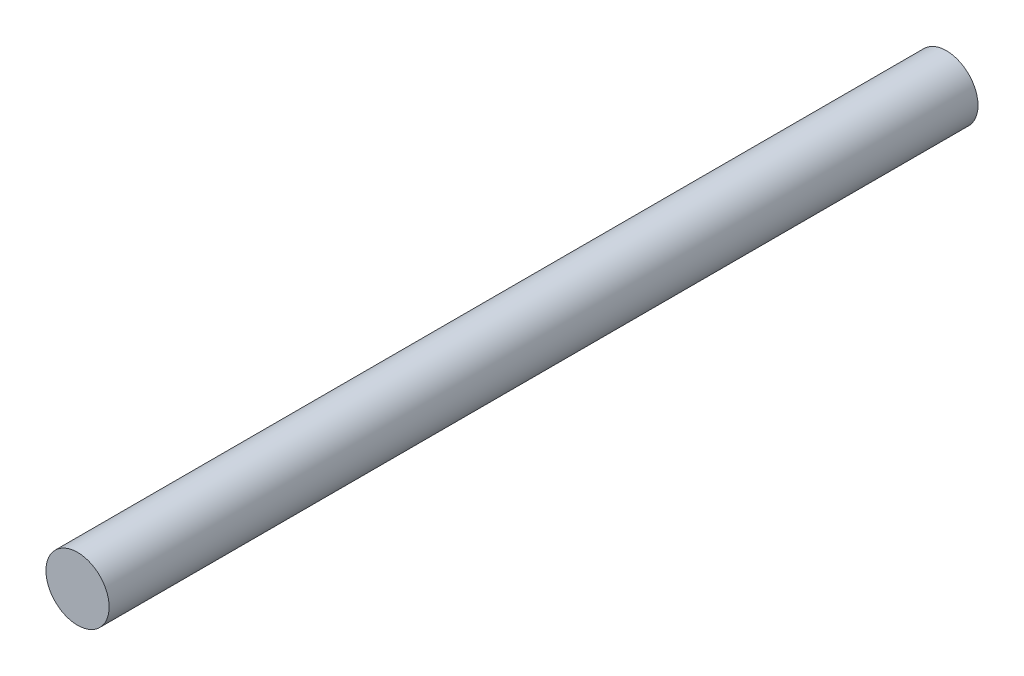
ISO-10303-21;
HEADER;
FILE_DESCRIPTION(('STEP AP214'),'2;1');
FILE_NAME('part.step','',(''),(''),'','','');
FILE_SCHEMA(('AUTOMOTIVE_DESIGN { 1 0 10303 214 1 1 1 1 }'));
ENDSEC;
DATA;
#1=APPLICATION_CONTEXT('core data for automotive mechanical design processes');
#2=APPLICATION_PROTOCOL_DEFINITION('international standard','automotive_design',2000,#1);
#3=PRODUCT_CONTEXT('',#1,'mechanical');
#4=PRODUCT('Part','Part','',(#3));
#5=PRODUCT_RELATED_PRODUCT_CATEGORY('part','',(#4));
#6=PRODUCT_DEFINITION_FORMATION('','',#4);
#7=PRODUCT_DEFINITION_CONTEXT('part definition',#1,'design');
#8=PRODUCT_DEFINITION('design','',#6,#7);
#9=PRODUCT_DEFINITION_SHAPE('','',#8);
#10=(LENGTH_UNIT() NAMED_UNIT(*) SI_UNIT(.MILLI.,.METRE.));
#11=(NAMED_UNIT(*) PLANE_ANGLE_UNIT() SI_UNIT($,.RADIAN.));
#12=(NAMED_UNIT(*) SI_UNIT($,.STERADIAN.) SOLID_ANGLE_UNIT());
#13=UNCERTAINTY_MEASURE_WITH_UNIT(LENGTH_MEASURE(1.E-05),#10,'distance_accuracy_value','');
#14=(GEOMETRIC_REPRESENTATION_CONTEXT(3) GLOBAL_UNCERTAINTY_ASSIGNED_CONTEXT((#13)) GLOBAL_UNIT_ASSIGNED_CONTEXT((#10,
#11,#12)) REPRESENTATION_CONTEXT('',''));
#15=CARTESIAN_POINT('',(0.,0.,0.));
#16=DIRECTION('',(0.,0.,1.));
#17=DIRECTION('',(1.,0.,0.));
#18=AXIS2_PLACEMENT_3D('',#15,#16,#17);
#19=CARTESIAN_POINT('',(0.,0.,137.5));
#20=DIRECTION('',(0.,0.,-1.));
#21=DIRECTION('',(-1.,0.,0.));
#22=AXIS2_PLACEMENT_3D('',#19,#20,#21);
#23=CYLINDRICAL_SURFACE('',#22,10.);
#24=CARTESIAN_POINT('',(0.,0.,137.5));
#25=DIRECTION('',(0.,0.,1.));
#26=DIRECTION('',(1.,0.,0.));
#27=AXIS2_PLACEMENT_3D('',#24,#25,#26);
#28=CIRCLE('',#27,10.);
#29=CARTESIAN_POINT('',(10.,0.,137.5));
#30=VERTEX_POINT('',#29);
#31=EDGE_CURVE('E10',#30,#30,#28,.T.);
#32=ORIENTED_EDGE('',*,*,#31,.F.);
#33=EDGE_LOOP('',(#32));
#34=FACE_BOUND('',#33,.T.);
#35=CARTESIAN_POINT('',(0.,0.,-137.5));
#36=DIRECTION('',(0.,0.,1.));
#37=DIRECTION('',(1.,0.,0.));
#38=AXIS2_PLACEMENT_3D('',#35,#36,#37);
#39=CIRCLE('',#38,10.);
#40=CARTESIAN_POINT('',(10.,0.,-137.5));
#41=VERTEX_POINT('',#40);
#42=EDGE_CURVE('E34',#41,#41,#39,.T.);
#43=ORIENTED_EDGE('',*,*,#42,.T.);
#44=EDGE_LOOP('',(#43));
#45=FACE_BOUND('',#44,.T.);
#46=ADVANCED_FACE('F31',(#34,#45),#23,.T.);
#47=CARTESIAN_POINT('',(0.,0.,137.5));
#48=DIRECTION('',(0.,0.,1.));
#49=DIRECTION('',(1.,0.,0.));
#50=AXIS2_PLACEMENT_3D('',#47,#48,#49);
#51=PLANE('',#50);
#52=ORIENTED_EDGE('',*,*,#31,.T.);
#53=EDGE_LOOP('',(#52));
#54=FACE_BOUND('',#53,.T.);
#55=ADVANCED_FACE('F46',(#54),#51,.T.);
#56=CARTESIAN_POINT('',(0.,0.,-137.5));
#57=DIRECTION('',(0.,0.,1.));
#58=DIRECTION('',(1.,0.,0.));
#59=AXIS2_PLACEMENT_3D('',#56,#57,#58);
#60=PLANE('',#59);
#61=ORIENTED_EDGE('',*,*,#42,.F.);
#62=EDGE_LOOP('',(#61));
#63=FACE_BOUND('',#62,.T.);
#64=ADVANCED_FACE('F44',(#63),#60,.F.);
#65=CLOSED_SHELL('',(#46,#55,#64));
#66=MANIFOLD_SOLID_BREP('B2',#65);
#67=ADVANCED_BREP_SHAPE_REPRESENTATION('',(#18,#66),#14);
#68=SHAPE_DEFINITION_REPRESENTATION(#9,#67);
ENDSEC;
END-ISO-10303-21;
